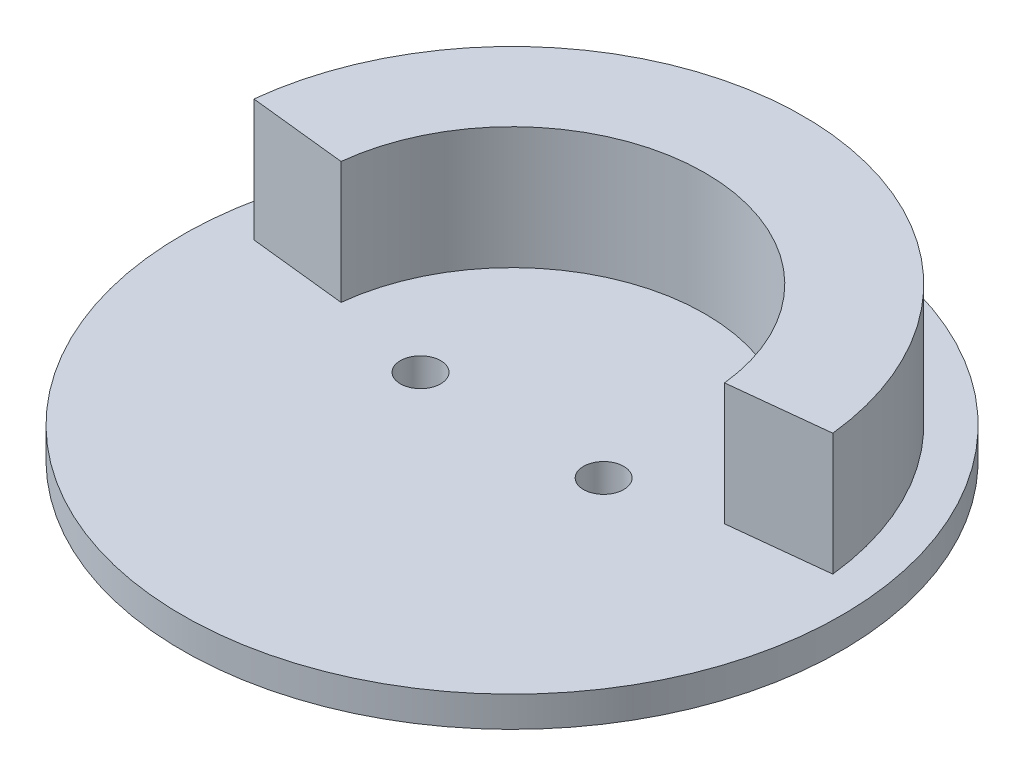
ISO-10303-21;
HEADER;
FILE_DESCRIPTION(('STEP AP214'),'2;1');
FILE_NAME('part.step','',(''),(''),'','','');
FILE_SCHEMA(('AUTOMOTIVE_DESIGN { 1 0 10303 214 1 1 1 1 }'));
ENDSEC;
DATA;
#1=APPLICATION_CONTEXT('core data for automotive mechanical design processes');
#2=APPLICATION_PROTOCOL_DEFINITION('international standard','automotive_design',2000,#1);
#3=PRODUCT_CONTEXT('',#1,'mechanical');
#4=PRODUCT('Part','Part','',(#3));
#5=PRODUCT_RELATED_PRODUCT_CATEGORY('part','',(#4));
#6=PRODUCT_DEFINITION_FORMATION('','',#4);
#7=PRODUCT_DEFINITION_CONTEXT('part definition',#1,'design');
#8=PRODUCT_DEFINITION('design','',#6,#7);
#9=PRODUCT_DEFINITION_SHAPE('','',#8);
#10=(LENGTH_UNIT() NAMED_UNIT(*) SI_UNIT(.MILLI.,.METRE.));
#11=(NAMED_UNIT(*) PLANE_ANGLE_UNIT() SI_UNIT($,.RADIAN.));
#12=(NAMED_UNIT(*) SI_UNIT($,.STERADIAN.) SOLID_ANGLE_UNIT());
#13=UNCERTAINTY_MEASURE_WITH_UNIT(LENGTH_MEASURE(1.E-05),#10,'distance_accuracy_value','');
#14=(GEOMETRIC_REPRESENTATION_CONTEXT(3) GLOBAL_UNCERTAINTY_ASSIGNED_CONTEXT((#13)) GLOBAL_UNIT_ASSIGNED_CONTEXT((#10,
#11,#12)) REPRESENTATION_CONTEXT('',''));
#15=CARTESIAN_POINT('',(0.,0.,0.));
#16=DIRECTION('',(0.,0.,1.));
#17=DIRECTION('',(1.,0.,0.));
#18=AXIS2_PLACEMENT_3D('',#15,#16,#17);
#19=CARTESIAN_POINT('',(-23.711759028986,10.,-2.56417311258515));
#20=DIRECTION('',(0.107512499479461,0.,-0.994203732871527));
#21=DIRECTION('',(-0.994203732871527,0.,-0.107512499479461));
#22=AXIS2_PLACEMENT_3D('',#19,#20,#21);
#23=PLANE('',#22);
#24=DIRECTION('',(0.994203732871527,0.,0.107512499479461));
#25=VECTOR('',#24,1.);
#26=CARTESIAN_POINT('',(-23.711759028986,0.,-2.56417311258515));
#27=LINE('',#26,#25);
#28=CARTESIAN_POINT('',(-23.711759028986,0.,-2.56417311258514));
#29=VERTEX_POINT('',#28);
#30=CARTESIAN_POINT('',(-15.7084189793701,0.,-1.69869749177548));
#31=VERTEX_POINT('',#30);
#32=EDGE_CURVE('E82',#29,#31,#27,.T.);
#33=ORIENTED_EDGE('',*,*,#32,.T.);
#34=DIRECTION('',(0.,-1.,0.));
#35=VECTOR('',#34,1.);
#36=CARTESIAN_POINT('',(-15.7084189793701,10.,-1.69869749177548));
#37=LINE('',#36,#35);
#38=CARTESIAN_POINT('',(-15.7084189793701,10.,-1.69869749177548));
#39=VERTEX_POINT('',#38);
#40=EDGE_CURVE('E11',#39,#31,#37,.T.);
#41=ORIENTED_EDGE('',*,*,#40,.F.);
#42=DIRECTION('',(0.994203732871527,0.,0.107512499479461));
#43=VECTOR('',#42,1.);
#44=CARTESIAN_POINT('',(-23.711759028986,10.,-2.56417311258515));
#45=LINE('',#44,#43);
#46=CARTESIAN_POINT('',(-23.711759028986,10.,-2.56417311258514));
#47=VERTEX_POINT('',#46);
#48=EDGE_CURVE('E111',#47,#39,#45,.T.);
#49=ORIENTED_EDGE('',*,*,#48,.F.);
#50=DIRECTION('',(0.,-1.,0.));
#51=VECTOR('',#50,1.);
#52=CARTESIAN_POINT('',(-23.711759028986,10.,-2.56417311258514));
#53=LINE('',#52,#51);
#54=EDGE_CURVE('E57',#47,#29,#53,.T.);
#55=ORIENTED_EDGE('',*,*,#54,.T.);
#56=EDGE_LOOP('',(#33,#41,#49,#55));
#57=FACE_BOUND('',#56,.T.);
#58=ADVANCED_FACE('F39',(#57),#23,.F.);
#59=CARTESIAN_POINT('',(0.,10.,0.));
#60=DIRECTION('',(0.,-1.,0.));
#61=DIRECTION('',(0.,0.,-1.));
#62=AXIS2_PLACEMENT_3D('',#59,#60,#61);
#63=CYLINDRICAL_SURFACE('',#62,15.8);
#64=CARTESIAN_POINT('',(0.,0.,0.));
#65=DIRECTION('',(0.,-1.,0.));
#66=DIRECTION('',(0.,0.,-1.));
#67=AXIS2_PLACEMENT_3D('',#64,#65,#66);
#68=CIRCLE('',#67,15.8);
#69=CARTESIAN_POINT('',(15.7084189793701,0.,-1.69869749177548));
#70=VERTEX_POINT('',#69);
#71=EDGE_CURVE('E79',#31,#70,#68,.T.);
#72=ORIENTED_EDGE('',*,*,#71,.T.);
#73=DIRECTION('',(0.,-1.,0.));
#74=VECTOR('',#73,1.);
#75=CARTESIAN_POINT('',(15.7084189793701,10.,-1.69869749177548));
#76=LINE('',#75,#74);
#77=CARTESIAN_POINT('',(15.7084189793701,10.,-1.69869749177548));
#78=VERTEX_POINT('',#77);
#79=EDGE_CURVE('E49',#78,#70,#76,.T.);
#80=ORIENTED_EDGE('',*,*,#79,.F.);
#81=CARTESIAN_POINT('',(0.,10.,0.));
#82=DIRECTION('',(0.,-1.,0.));
#83=DIRECTION('',(0.,0.,-1.));
#84=AXIS2_PLACEMENT_3D('',#81,#82,#83);
#85=CIRCLE('',#84,15.8);
#86=EDGE_CURVE('E92',#39,#78,#85,.T.);
#87=ORIENTED_EDGE('',*,*,#86,.F.);
#88=ORIENTED_EDGE('',*,*,#40,.T.);
#89=EDGE_LOOP('',(#72,#80,#87,#88));
#90=FACE_BOUND('',#89,.T.);
#91=ADVANCED_FACE('F91',(#90),#63,.F.);
#92=CARTESIAN_POINT('',(23.711759028986,10.,-2.56417311258515));
#93=DIRECTION('',(0.107512499479461,0.,0.994203732871527));
#94=DIRECTION('',(0.994203732871527,0.,-0.107512499479461));
#95=AXIS2_PLACEMENT_3D('',#92,#93,#94);
#96=PLANE('',#95);
#97=DIRECTION('',(-0.994203732871527,0.,0.107512499479461));
#98=VECTOR('',#97,1.);
#99=CARTESIAN_POINT('',(23.711759028986,0.,-2.56417311258515));
#100=LINE('',#99,#98);
#101=CARTESIAN_POINT('',(23.711759028986,0.,-2.56417311258515));
#102=VERTEX_POINT('',#101);
#103=EDGE_CURVE('E84',#102,#70,#100,.T.);
#104=ORIENTED_EDGE('',*,*,#103,.F.);
#105=DIRECTION('',(0.,-1.,0.));
#106=VECTOR('',#105,1.);
#107=CARTESIAN_POINT('',(23.711759028986,10.,-2.56417311258515));
#108=LINE('',#107,#106);
#109=CARTESIAN_POINT('',(23.711759028986,10.,-2.56417311258515));
#110=VERTEX_POINT('',#109);
#111=EDGE_CURVE('E114',#110,#102,#108,.T.);
#112=ORIENTED_EDGE('',*,*,#111,.F.);
#113=DIRECTION('',(-0.994203732871527,0.,0.107512499479461));
#114=VECTOR('',#113,1.);
#115=CARTESIAN_POINT('',(23.711759028986,10.,-2.56417311258515));
#116=LINE('',#115,#114);
#117=EDGE_CURVE('E143',#110,#78,#116,.T.);
#118=ORIENTED_EDGE('',*,*,#117,.T.);
#119=ORIENTED_EDGE('',*,*,#79,.T.);
#120=EDGE_LOOP('',(#104,#112,#118,#119));
#121=FACE_BOUND('',#120,.T.);
#122=ADVANCED_FACE('F153',(#121),#96,.T.);
#123=CARTESIAN_POINT('',(0.,10.,1.28369537222284E-13));
#124=DIRECTION('',(0.,-1.,0.));
#125=DIRECTION('',(0.,0.,-1.));
#126=AXIS2_PLACEMENT_3D('',#123,#124,#125);
#127=CYLINDRICAL_SURFACE('',#126,23.8500000000001);
#128=CARTESIAN_POINT('',(0.,0.,1.28369537222284E-13));
#129=DIRECTION('',(0.,-1.,0.));
#130=DIRECTION('',(0.,0.,-1.));
#131=AXIS2_PLACEMENT_3D('',#128,#129,#130);
#132=CIRCLE('',#131,23.8500000000001);
#133=EDGE_CURVE('E108',#29,#102,#132,.T.);
#134=ORIENTED_EDGE('',*,*,#133,.F.);
#135=ORIENTED_EDGE('',*,*,#54,.F.);
#136=CARTESIAN_POINT('',(0.,10.,1.28369537222284E-13));
#137=DIRECTION('',(0.,-1.,0.));
#138=DIRECTION('',(0.,0.,-1.));
#139=AXIS2_PLACEMENT_3D('',#136,#137,#138);
#140=CIRCLE('',#139,23.8500000000001);
#141=EDGE_CURVE('E103',#47,#110,#140,.T.);
#142=ORIENTED_EDGE('',*,*,#141,.T.);
#143=ORIENTED_EDGE('',*,*,#111,.T.);
#144=EDGE_LOOP('',(#134,#135,#142,#143));
#145=FACE_BOUND('',#144,.T.);
#146=ADVANCED_FACE('F150',(#145),#127,.T.);
#147=CARTESIAN_POINT('',(0.,10.,0.));
#148=DIRECTION('',(0.,-1.,0.));
#149=DIRECTION('',(0.,0.,-1.));
#150=AXIS2_PLACEMENT_3D('',#147,#148,#149);
#151=PLANE('',#150);
#152=ORIENTED_EDGE('',*,*,#48,.T.);
#153=ORIENTED_EDGE('',*,*,#86,.T.);
#154=ORIENTED_EDGE('',*,*,#117,.F.);
#155=ORIENTED_EDGE('',*,*,#141,.F.);
#156=EDGE_LOOP('',(#152,#153,#154,#155));
#157=FACE_BOUND('',#156,.T.);
#158=ADVANCED_FACE('F152',(#157),#151,.F.);
#159=CARTESIAN_POINT('',(0.,0.,0.));
#160=DIRECTION('',(0.,-1.,0.));
#161=DIRECTION('',(0.,0.,-1.));
#162=AXIS2_PLACEMENT_3D('',#159,#160,#161);
#163=PLANE('',#162);
#164=CARTESIAN_POINT('',(-7.5,0.,0.));
#165=DIRECTION('',(0.,1.,0.));
#166=DIRECTION('',(0.,0.,1.));
#167=AXIS2_PLACEMENT_3D('',#164,#165,#166);
#168=CIRCLE('',#167,1.65);
#169=CARTESIAN_POINT('',(-7.5,0.,1.65));
#170=VERTEX_POINT('',#169);
#171=EDGE_CURVE('E122',#170,#170,#168,.T.);
#172=ORIENTED_EDGE('',*,*,#171,.F.);
#173=EDGE_LOOP('',(#172));
#174=FACE_BOUND('',#173,.T.);
#175=CARTESIAN_POINT('',(7.5,0.,0.));
#176=DIRECTION('',(0.,1.,0.));
#177=DIRECTION('',(0.,0.,-1.));
#178=AXIS2_PLACEMENT_3D('',#175,#176,#177);
#179=CIRCLE('',#178,1.65);
#180=CARTESIAN_POINT('',(7.5,0.,-1.65));
#181=VERTEX_POINT('',#180);
#182=EDGE_CURVE('E129',#181,#181,#179,.T.);
#183=ORIENTED_EDGE('',*,*,#182,.F.);
#184=EDGE_LOOP('',(#183));
#185=FACE_BOUND('',#184,.T.);
#186=CARTESIAN_POINT('',(0.,0.,0.));
#187=DIRECTION('',(0.,-1.,0.));
#188=DIRECTION('',(0.,0.,-1.));
#189=AXIS2_PLACEMENT_3D('',#186,#187,#188);
#190=CIRCLE('',#189,27.);
#191=CARTESIAN_POINT('',(0.,0.,-27.));
#192=VERTEX_POINT('',#191);
#193=EDGE_CURVE('E100',#192,#192,#190,.T.);
#194=ORIENTED_EDGE('',*,*,#193,.F.);
#195=EDGE_LOOP('',(#194));
#196=FACE_BOUND('',#195,.T.);
#197=ORIENTED_EDGE('',*,*,#32,.F.);
#198=ORIENTED_EDGE('',*,*,#133,.T.);
#199=ORIENTED_EDGE('',*,*,#103,.T.);
#200=ORIENTED_EDGE('',*,*,#71,.F.);
#201=EDGE_LOOP('',(#197,#198,#199,#200));
#202=FACE_BOUND('',#201,.T.);
#203=ADVANCED_FACE('F80',(#174,#185,#196,#202),#163,.F.);
#204=CARTESIAN_POINT('',(0.,-2.5,0.));
#205=DIRECTION('',(0.,1.,0.));
#206=DIRECTION('',(0.,0.,1.));
#207=AXIS2_PLACEMENT_3D('',#204,#205,#206);
#208=CYLINDRICAL_SURFACE('',#207,27.);
#209=CARTESIAN_POINT('',(0.,-2.5,0.));
#210=DIRECTION('',(0.,-1.,0.));
#211=DIRECTION('',(0.,0.,-1.));
#212=AXIS2_PLACEMENT_3D('',#209,#210,#211);
#213=CIRCLE('',#212,27.);
#214=CARTESIAN_POINT('',(0.,-2.5,-27.));
#215=VERTEX_POINT('',#214);
#216=EDGE_CURVE('E96',#215,#215,#213,.T.);
#217=ORIENTED_EDGE('',*,*,#216,.F.);
#218=EDGE_LOOP('',(#217));
#219=FACE_BOUND('',#218,.T.);
#220=ORIENTED_EDGE('',*,*,#193,.T.);
#221=EDGE_LOOP('',(#220));
#222=FACE_BOUND('',#221,.T.);
#223=ADVANCED_FACE('F186',(#219,#222),#208,.T.);
#224=CARTESIAN_POINT('',(0.,-2.5,0.));
#225=DIRECTION('',(0.,-1.,0.));
#226=DIRECTION('',(0.,0.,-1.));
#227=AXIS2_PLACEMENT_3D('',#224,#225,#226);
#228=PLANE('',#227);
#229=CARTESIAN_POINT('',(-7.5,-2.5,0.));
#230=DIRECTION('',(0.,-1.,0.));
#231=DIRECTION('',(0.,0.,-1.));
#232=AXIS2_PLACEMENT_3D('',#229,#230,#231);
#233=CIRCLE('',#232,1.65);
#234=CARTESIAN_POINT('',(-7.5,-2.5,-1.65));
#235=VERTEX_POINT('',#234);
#236=EDGE_CURVE('E42',#235,#235,#233,.T.);
#237=ORIENTED_EDGE('',*,*,#236,.F.);
#238=EDGE_LOOP('',(#237));
#239=FACE_BOUND('',#238,.T.);
#240=CARTESIAN_POINT('',(7.5,-2.5,0.));
#241=DIRECTION('',(0.,-1.,0.));
#242=DIRECTION('',(0.,0.,-1.));
#243=AXIS2_PLACEMENT_3D('',#240,#241,#242);
#244=CIRCLE('',#243,1.65);
#245=CARTESIAN_POINT('',(7.5,-2.5,-1.65));
#246=VERTEX_POINT('',#245);
#247=EDGE_CURVE('E119',#246,#246,#244,.T.);
#248=ORIENTED_EDGE('',*,*,#247,.F.);
#249=EDGE_LOOP('',(#248));
#250=FACE_BOUND('',#249,.T.);
#251=ORIENTED_EDGE('',*,*,#216,.T.);
#252=EDGE_LOOP('',(#251));
#253=FACE_BOUND('',#252,.T.);
#254=ADVANCED_FACE('F191',(#239,#250,#253),#228,.T.);
#255=CARTESIAN_POINT('',(7.5,-10.,0.));
#256=DIRECTION('',(0.,1.,0.));
#257=DIRECTION('',(0.,0.,1.));
#258=AXIS2_PLACEMENT_3D('',#255,#256,#257);
#259=CYLINDRICAL_SURFACE('',#258,1.65);
#260=ORIENTED_EDGE('',*,*,#247,.T.);
#261=EDGE_LOOP('',(#260));
#262=FACE_BOUND('',#261,.T.);
#263=ORIENTED_EDGE('',*,*,#182,.T.);
#264=EDGE_LOOP('',(#263));
#265=FACE_BOUND('',#264,.T.);
#266=ADVANCED_FACE('F210',(#262,#265),#259,.F.);
#267=CARTESIAN_POINT('',(-7.5,-10.,0.));
#268=DIRECTION('',(0.,1.,0.));
#269=DIRECTION('',(0.,0.,1.));
#270=AXIS2_PLACEMENT_3D('',#267,#268,#269);
#271=CYLINDRICAL_SURFACE('',#270,1.65);
#272=ORIENTED_EDGE('',*,*,#236,.T.);
#273=EDGE_LOOP('',(#272));
#274=FACE_BOUND('',#273,.T.);
#275=ORIENTED_EDGE('',*,*,#171,.T.);
#276=EDGE_LOOP('',(#275));
#277=FACE_BOUND('',#276,.T.);
#278=ADVANCED_FACE('F220',(#274,#277),#271,.F.);
#279=CLOSED_SHELL('',(#58,#91,#122,#146,#158,#203,#223,#254,#266,#278));
#280=MANIFOLD_SOLID_BREP('B2',#279);
#281=ADVANCED_BREP_SHAPE_REPRESENTATION('',(#18,#280),#14);
#282=SHAPE_DEFINITION_REPRESENTATION(#9,#281);
ENDSEC;
END-ISO-10303-21;
